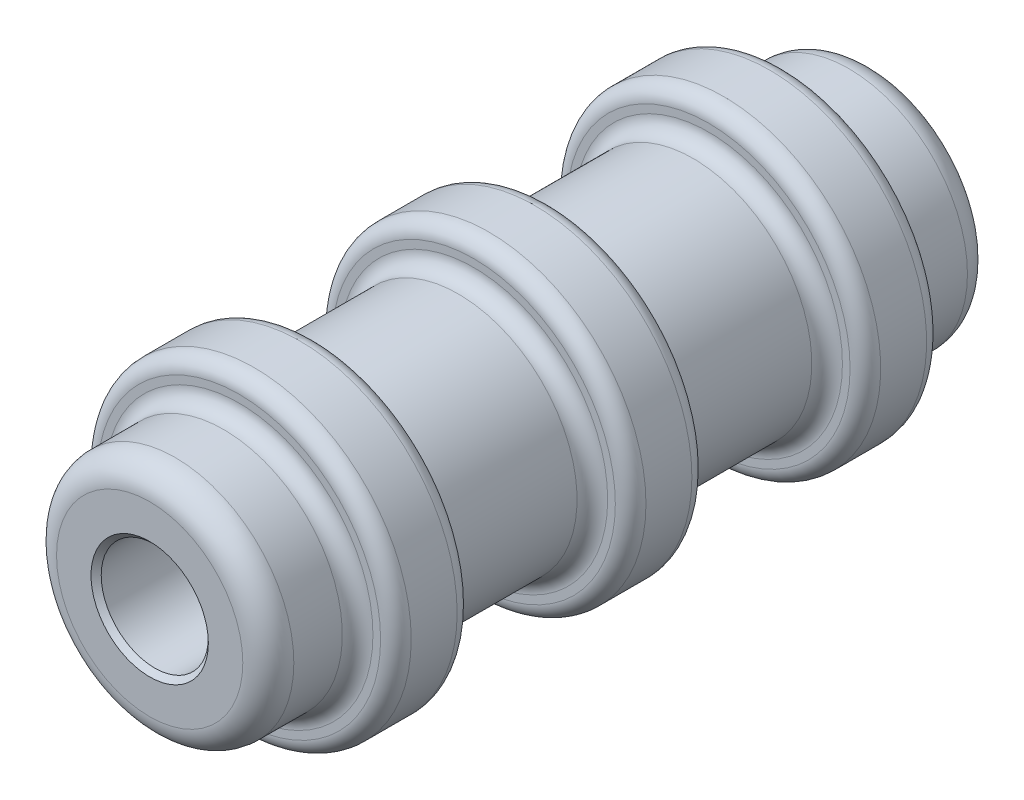
ISO-10303-21;
HEADER;
FILE_DESCRIPTION(('STEP AP214'),'2;1');
FILE_NAME('part.step','',(''),(''),'','','');
FILE_SCHEMA(('AUTOMOTIVE_DESIGN { 1 0 10303 214 1 1 1 1 }'));
ENDSEC;
DATA;
#1=APPLICATION_CONTEXT('core data for automotive mechanical design processes');
#2=APPLICATION_PROTOCOL_DEFINITION('international standard','automotive_design',2000,#1);
#3=PRODUCT_CONTEXT('',#1,'mechanical');
#4=PRODUCT('Part','Part','',(#3));
#5=PRODUCT_RELATED_PRODUCT_CATEGORY('part','',(#4));
#6=PRODUCT_DEFINITION_FORMATION('','',#4);
#7=PRODUCT_DEFINITION_CONTEXT('part definition',#1,'design');
#8=PRODUCT_DEFINITION('design','',#6,#7);
#9=PRODUCT_DEFINITION_SHAPE('','',#8);
#10=(LENGTH_UNIT() NAMED_UNIT(*) SI_UNIT(.MILLI.,.METRE.));
#11=(NAMED_UNIT(*) PLANE_ANGLE_UNIT() SI_UNIT($,.RADIAN.));
#12=(NAMED_UNIT(*) SI_UNIT($,.STERADIAN.) SOLID_ANGLE_UNIT());
#13=UNCERTAINTY_MEASURE_WITH_UNIT(LENGTH_MEASURE(1.E-05),#10,'distance_accuracy_value','');
#14=(GEOMETRIC_REPRESENTATION_CONTEXT(3) GLOBAL_UNCERTAINTY_ASSIGNED_CONTEXT((#13)) GLOBAL_UNIT_ASSIGNED_CONTEXT((#10,
#11,#12)) REPRESENTATION_CONTEXT('',''));
#15=CARTESIAN_POINT('',(0.,0.,0.));
#16=DIRECTION('',(0.,0.,1.));
#17=DIRECTION('',(1.,0.,0.));
#18=AXIS2_PLACEMENT_3D('',#15,#16,#17);
#19=CARTESIAN_POINT('',(0.,0.,0.750000000000001));
#20=DIRECTION('',(0.,0.,-1.));
#21=DIRECTION('',(-1.,0.,0.));
#22=AXIS2_PLACEMENT_3D('',#19,#20,#21);
#23=CYLINDRICAL_SURFACE('',#22,3.075);
#24=CARTESIAN_POINT('',(0.,0.,0.449999999999999));
#25=DIRECTION('',(0.,0.,1.));
#26=DIRECTION('',(1.,0.,0.));
#27=AXIS2_PLACEMENT_3D('',#24,#25,#26);
#28=CIRCLE('',#27,3.075);
#29=CARTESIAN_POINT('',(3.075,0.,0.449999999999999));
#30=VERTEX_POINT('',#29);
#31=EDGE_CURVE('E129',#30,#30,#28,.T.);
#32=ORIENTED_EDGE('',*,*,#31,.F.);
#33=EDGE_LOOP('',(#32));
#34=FACE_BOUND('',#33,.T.);
#35=CARTESIAN_POINT('',(0.,0.,-0.449999999999999));
#36=DIRECTION('',(0.,0.,1.));
#37=DIRECTION('',(1.,0.,0.));
#38=AXIS2_PLACEMENT_3D('',#35,#36,#37);
#39=CIRCLE('',#38,3.075);
#40=CARTESIAN_POINT('',(3.075,0.,-0.449999999999999));
#41=VERTEX_POINT('',#40);
#42=EDGE_CURVE('E183',#41,#41,#39,.F.);
#43=ORIENTED_EDGE('',*,*,#42,.F.);
#44=EDGE_LOOP('',(#43));
#45=FACE_BOUND('',#44,.T.);
#46=ADVANCED_FACE('F17',(#34,#45),#23,.T.);
#47=CARTESIAN_POINT('',(0.,0.,-0.449999999999999));
#48=DIRECTION('',(0.,0.,1.));
#49=DIRECTION('',(1.,0.,0.));
#50=AXIS2_PLACEMENT_3D('',#47,#48,#49);
#51=TOROIDAL_SURFACE('',#50,2.775,0.3);
#52=CARTESIAN_POINT('',(0.,0.,-0.749999999999999));
#53=DIRECTION('',(0.,0.,1.));
#54=DIRECTION('',(1.,0.,0.));
#55=AXIS2_PLACEMENT_3D('',#52,#53,#54);
#56=CIRCLE('',#55,2.775);
#57=CARTESIAN_POINT('',(2.775,0.,-0.75));
#58=VERTEX_POINT('',#57);
#59=CARTESIAN_POINT('',(-2.775,0.,-0.75));
#60=VERTEX_POINT('',#59);
#61=EDGE_CURVE('E116',#58,#60,#56,.T.);
#62=ORIENTED_EDGE('',*,*,#61,.T.);
#63=CARTESIAN_POINT('',(0.,0.,-0.749999999999999));
#64=DIRECTION('',(0.,0.,1.));
#65=DIRECTION('',(-1.,0.,0.));
#66=AXIS2_PLACEMENT_3D('',#63,#64,#65);
#67=CIRCLE('',#66,2.775);
#68=EDGE_CURVE('E119',#60,#58,#67,.T.);
#69=ORIENTED_EDGE('',*,*,#68,.T.);
#70=EDGE_LOOP('',(#62,#69));
#71=FACE_BOUND('',#70,.T.);
#72=ORIENTED_EDGE('',*,*,#42,.T.);
#73=EDGE_LOOP('',(#72));
#74=FACE_BOUND('',#73,.T.);
#75=ADVANCED_FACE('F127',(#71,#74),#51,.T.);
#76=CARTESIAN_POINT('',(0.,0.,0.449999999999999));
#77=DIRECTION('',(0.,0.,1.));
#78=DIRECTION('',(1.,0.,0.));
#79=AXIS2_PLACEMENT_3D('',#76,#77,#78);
#80=TOROIDAL_SURFACE('',#79,2.775,0.3);
#81=ORIENTED_EDGE('',*,*,#31,.T.);
#82=EDGE_LOOP('',(#81));
#83=FACE_BOUND('',#82,.T.);
#84=CARTESIAN_POINT('',(0.,0.,0.749999999999999));
#85=DIRECTION('',(0.,0.,-1.));
#86=DIRECTION('',(1.,0.,0.));
#87=AXIS2_PLACEMENT_3D('',#84,#85,#86);
#88=CIRCLE('',#87,2.775);
#89=CARTESIAN_POINT('',(-2.775,0.,0.75));
#90=VERTEX_POINT('',#89);
#91=CARTESIAN_POINT('',(2.775,0.,0.75));
#92=VERTEX_POINT('',#91);
#93=EDGE_CURVE('E163',#90,#92,#88,.F.);
#94=ORIENTED_EDGE('',*,*,#93,.F.);
#95=CARTESIAN_POINT('',(0.,0.,0.749999999999999));
#96=DIRECTION('',(0.,0.,-1.));
#97=DIRECTION('',(-1.,0.,0.));
#98=AXIS2_PLACEMENT_3D('',#95,#96,#97);
#99=CIRCLE('',#98,2.775);
#100=EDGE_CURVE('E124',#92,#90,#99,.F.);
#101=ORIENTED_EDGE('',*,*,#100,.F.);
#102=EDGE_LOOP('',(#94,#101));
#103=FACE_BOUND('',#102,.T.);
#104=ADVANCED_FACE('F137',(#83,#103),#80,.T.);
#105=CARTESIAN_POINT('',(0.,0.,-0.750000000000001));
#106=DIRECTION('',(0.,0.,1.));
#107=DIRECTION('',(1.,0.,0.));
#108=AXIS2_PLACEMENT_3D('',#105,#106,#107);
#109=PLANE('',#108);
#110=CARTESIAN_POINT('',(0.,0.,-0.749999999999999));
#111=DIRECTION('',(0.,0.,-1.));
#112=DIRECTION('',(1.,0.,0.));
#113=AXIS2_PLACEMENT_3D('',#110,#111,#112);
#114=CIRCLE('',#113,2.625);
#115=CARTESIAN_POINT('',(-2.625,0.,-0.75));
#116=VERTEX_POINT('',#115);
#117=CARTESIAN_POINT('',(2.625,0.,-0.75));
#118=VERTEX_POINT('',#117);
#119=EDGE_CURVE('E512',#116,#118,#114,.F.);
#120=ORIENTED_EDGE('',*,*,#119,.T.);
#121=CARTESIAN_POINT('',(0.,0.,-0.749999999999999));
#122=DIRECTION('',(0.,0.,-1.));
#123=DIRECTION('',(-1.,0.,0.));
#124=AXIS2_PLACEMENT_3D('',#121,#122,#123);
#125=CIRCLE('',#124,2.625);
#126=EDGE_CURVE('E522',#118,#116,#125,.F.);
#127=ORIENTED_EDGE('',*,*,#126,.T.);
#128=EDGE_LOOP('',(#120,#127));
#129=FACE_BOUND('',#128,.T.);
#130=ORIENTED_EDGE('',*,*,#61,.F.);
#131=ORIENTED_EDGE('',*,*,#68,.F.);
#132=EDGE_LOOP('',(#130,#131));
#133=FACE_BOUND('',#132,.T.);
#134=ADVANCED_FACE('F121',(#129,#133),#109,.F.);
#135=CARTESIAN_POINT('',(0.,0.,0.750000000000001));
#136=DIRECTION('',(0.,0.,1.));
#137=DIRECTION('',(1.,0.,0.));
#138=AXIS2_PLACEMENT_3D('',#135,#136,#137);
#139=PLANE('',#138);
#140=CARTESIAN_POINT('',(0.,0.,0.749999999999999));
#141=DIRECTION('',(0.,0.,1.));
#142=DIRECTION('',(-1.,0.,0.));
#143=AXIS2_PLACEMENT_3D('',#140,#141,#142);
#144=CIRCLE('',#143,2.625);
#145=CARTESIAN_POINT('',(2.625,0.,0.75));
#146=VERTEX_POINT('',#145);
#147=CARTESIAN_POINT('',(-2.625,0.,0.75));
#148=VERTEX_POINT('',#147);
#149=EDGE_CURVE('E526',#146,#148,#144,.F.);
#150=ORIENTED_EDGE('',*,*,#149,.T.);
#151=CARTESIAN_POINT('',(0.,0.,0.749999999999999));
#152=DIRECTION('',(0.,0.,1.));
#153=DIRECTION('',(1.,0.,0.));
#154=AXIS2_PLACEMENT_3D('',#151,#152,#153);
#155=CIRCLE('',#154,2.625);
#156=EDGE_CURVE('E551',#148,#146,#155,.F.);
#157=ORIENTED_EDGE('',*,*,#156,.T.);
#158=EDGE_LOOP('',(#150,#157));
#159=FACE_BOUND('',#158,.T.);
#160=ORIENTED_EDGE('',*,*,#100,.T.);
#161=ORIENTED_EDGE('',*,*,#93,.T.);
#162=EDGE_LOOP('',(#160,#161));
#163=FACE_BOUND('',#162,.T.);
#164=ADVANCED_FACE('F560',(#159,#163),#139,.T.);
#165=CARTESIAN_POINT('',(0.,0.,-1.05));
#166=DIRECTION('',(0.,0.,1.));
#167=DIRECTION('',(1.,0.,0.));
#168=AXIS2_PLACEMENT_3D('',#165,#166,#167);
#169=TOROIDAL_SURFACE('',#168,2.625,0.3);
#170=ORIENTED_EDGE('',*,*,#126,.F.);
#171=ORIENTED_EDGE('',*,*,#119,.F.);
#172=EDGE_LOOP('',(#170,#171));
#173=FACE_BOUND('',#172,.T.);
#174=CARTESIAN_POINT('',(0.,0.,-1.05));
#175=DIRECTION('',(0.,0.,-1.));
#176=DIRECTION('',(-1.,0.,0.));
#177=AXIS2_PLACEMENT_3D('',#174,#175,#176);
#178=CIRCLE('',#177,2.325);
#179=CARTESIAN_POINT('',(-2.325,0.,-1.05));
#180=VERTEX_POINT('',#179);
#181=EDGE_CURVE('E482',#180,#180,#178,.T.);
#182=ORIENTED_EDGE('',*,*,#181,.F.);
#183=EDGE_LOOP('',(#182));
#184=FACE_BOUND('',#183,.T.);
#185=ADVANCED_FACE('F492',(#173,#184),#169,.F.);
#186=CARTESIAN_POINT('',(0.,0.,1.05));
#187=DIRECTION('',(0.,0.,1.));
#188=DIRECTION('',(1.,0.,0.));
#189=AXIS2_PLACEMENT_3D('',#186,#187,#188);
#190=TOROIDAL_SURFACE('',#189,2.625,0.3);
#191=CARTESIAN_POINT('',(0.,0.,1.05));
#192=DIRECTION('',(0.,0.,-1.));
#193=DIRECTION('',(-1.,0.,0.));
#194=AXIS2_PLACEMENT_3D('',#191,#192,#193);
#195=CIRCLE('',#194,2.325);
#196=CARTESIAN_POINT('',(-2.325,0.,1.05));
#197=VERTEX_POINT('',#196);
#198=EDGE_CURVE('E479',#197,#197,#195,.F.);
#199=ORIENTED_EDGE('',*,*,#198,.F.);
#200=EDGE_LOOP('',(#199));
#201=FACE_BOUND('',#200,.T.);
#202=ORIENTED_EDGE('',*,*,#149,.F.);
#203=ORIENTED_EDGE('',*,*,#156,.F.);
#204=EDGE_LOOP('',(#202,#203));
#205=FACE_BOUND('',#204,.T.);
#206=ADVANCED_FACE('F487',(#201,#205),#190,.F.);
#207=CARTESIAN_POINT('',(0.,0.,7.1));
#208=DIRECTION('',(0.,0.,-1.));
#209=DIRECTION('',(-1.,0.,0.));
#210=AXIS2_PLACEMENT_3D('',#207,#208,#209);
#211=CYLINDRICAL_SURFACE('',#210,2.325);
#212=CARTESIAN_POINT('',(0.,0.,-3.55));
#213=DIRECTION('',(0.,0.,-1.));
#214=DIRECTION('',(-1.,0.,0.));
#215=AXIS2_PLACEMENT_3D('',#212,#213,#214);
#216=CIRCLE('',#215,2.325);
#217=CARTESIAN_POINT('',(-2.325,0.,-3.55));
#218=VERTEX_POINT('',#217);
#219=EDGE_CURVE('E476',#218,#218,#216,.F.);
#220=ORIENTED_EDGE('',*,*,#219,.T.);
#221=EDGE_LOOP('',(#220));
#222=FACE_BOUND('',#221,.T.);
#223=ORIENTED_EDGE('',*,*,#181,.T.);
#224=EDGE_LOOP('',(#223));
#225=FACE_BOUND('',#224,.T.);
#226=ADVANCED_FACE('F491',(#222,#225),#211,.T.);
#227=CARTESIAN_POINT('',(0.,0.,7.1));
#228=DIRECTION('',(0.,0.,-1.));
#229=DIRECTION('',(-1.,0.,0.));
#230=AXIS2_PLACEMENT_3D('',#227,#228,#229);
#231=CYLINDRICAL_SURFACE('',#230,2.325);
#232=ORIENTED_EDGE('',*,*,#198,.T.);
#233=EDGE_LOOP('',(#232));
#234=FACE_BOUND('',#233,.T.);
#235=CARTESIAN_POINT('',(0.,0.,3.55));
#236=DIRECTION('',(0.,0.,1.));
#237=DIRECTION('',(1.,0.,0.));
#238=AXIS2_PLACEMENT_3D('',#235,#236,#237);
#239=CIRCLE('',#238,2.325);
#240=CARTESIAN_POINT('',(2.325,0.,3.55));
#241=VERTEX_POINT('',#240);
#242=EDGE_CURVE('E467',#241,#241,#239,.F.);
#243=ORIENTED_EDGE('',*,*,#242,.T.);
#244=EDGE_LOOP('',(#243));
#245=FACE_BOUND('',#244,.T.);
#246=ADVANCED_FACE('F766',(#234,#245),#231,.T.);
#247=CARTESIAN_POINT('',(0.,0.,-3.55));
#248=DIRECTION('',(0.,0.,-1.));
#249=DIRECTION('',(-1.,0.,0.));
#250=AXIS2_PLACEMENT_3D('',#247,#248,#249);
#251=TOROIDAL_SURFACE('',#250,2.625,0.3);
#252=CARTESIAN_POINT('',(0.,0.,-3.85));
#253=DIRECTION('',(0.,0.,1.));
#254=DIRECTION('',(1.,0.,0.));
#255=AXIS2_PLACEMENT_3D('',#252,#253,#254);
#256=CIRCLE('',#255,2.625);
#257=CARTESIAN_POINT('',(2.625,0.,-3.85));
#258=VERTEX_POINT('',#257);
#259=CARTESIAN_POINT('',(-2.625,0.,-3.85));
#260=VERTEX_POINT('',#259);
#261=EDGE_CURVE('E463',#258,#260,#256,.T.);
#262=ORIENTED_EDGE('',*,*,#261,.T.);
#263=CARTESIAN_POINT('',(0.,0.,-3.85));
#264=DIRECTION('',(0.,0.,1.));
#265=DIRECTION('',(-1.,0.,0.));
#266=AXIS2_PLACEMENT_3D('',#263,#264,#265);
#267=CIRCLE('',#266,2.625);
#268=EDGE_CURVE('E475',#260,#258,#267,.T.);
#269=ORIENTED_EDGE('',*,*,#268,.T.);
#270=EDGE_LOOP('',(#262,#269));
#271=FACE_BOUND('',#270,.T.);
#272=ORIENTED_EDGE('',*,*,#219,.F.);
#273=EDGE_LOOP('',(#272));
#274=FACE_BOUND('',#273,.T.);
#275=ADVANCED_FACE('F437',(#271,#274),#251,.F.);
#276=CARTESIAN_POINT('',(0.,0.,3.55));
#277=DIRECTION('',(0.,0.,1.));
#278=DIRECTION('',(1.,0.,0.));
#279=AXIS2_PLACEMENT_3D('',#276,#277,#278);
#280=TOROIDAL_SURFACE('',#279,2.625,0.3);
#281=CARTESIAN_POINT('',(0.,0.,3.85));
#282=DIRECTION('',(0.,0.,-1.));
#283=DIRECTION('',(-1.,0.,0.));
#284=AXIS2_PLACEMENT_3D('',#281,#282,#283);
#285=CIRCLE('',#284,2.625);
#286=CARTESIAN_POINT('',(-2.625,0.,3.85));
#287=VERTEX_POINT('',#286);
#288=CARTESIAN_POINT('',(2.625,0.,3.85));
#289=VERTEX_POINT('',#288);
#290=EDGE_CURVE('E450',#287,#289,#285,.T.);
#291=ORIENTED_EDGE('',*,*,#290,.T.);
#292=CARTESIAN_POINT('',(0.,0.,3.85));
#293=DIRECTION('',(0.,0.,-1.));
#294=DIRECTION('',(1.,0.,0.));
#295=AXIS2_PLACEMENT_3D('',#292,#293,#294);
#296=CIRCLE('',#295,2.625);
#297=EDGE_CURVE('E418',#289,#287,#296,.T.);
#298=ORIENTED_EDGE('',*,*,#297,.T.);
#299=EDGE_LOOP('',(#291,#298));
#300=FACE_BOUND('',#299,.T.);
#301=ORIENTED_EDGE('',*,*,#242,.F.);
#302=EDGE_LOOP('',(#301));
#303=FACE_BOUND('',#302,.T.);
#304=ADVANCED_FACE('F425',(#300,#303),#280,.F.);
#305=CARTESIAN_POINT('',(0.,0.,-3.85));
#306=DIRECTION('',(0.,0.,-1.));
#307=DIRECTION('',(-1.,0.,0.));
#308=AXIS2_PLACEMENT_3D('',#305,#306,#307);
#309=PLANE('',#308);
#310=ORIENTED_EDGE('',*,*,#268,.F.);
#311=ORIENTED_EDGE('',*,*,#261,.F.);
#312=EDGE_LOOP('',(#310,#311));
#313=FACE_BOUND('',#312,.T.);
#314=CARTESIAN_POINT('',(0.,0.,-3.85));
#315=DIRECTION('',(0.,0.,-1.));
#316=DIRECTION('',(-1.,0.,0.));
#317=AXIS2_PLACEMENT_3D('',#314,#315,#316);
#318=CIRCLE('',#317,2.775);
#319=CARTESIAN_POINT('',(-2.775,0.,-3.85));
#320=VERTEX_POINT('',#319);
#321=CARTESIAN_POINT('',(2.775,0.,-3.85));
#322=VERTEX_POINT('',#321);
#323=EDGE_CURVE('E404',#320,#322,#318,.T.);
#324=ORIENTED_EDGE('',*,*,#323,.F.);
#325=CARTESIAN_POINT('',(0.,0.,-3.85));
#326=DIRECTION('',(0.,0.,-1.));
#327=DIRECTION('',(1.,0.,0.));
#328=AXIS2_PLACEMENT_3D('',#325,#326,#327);
#329=CIRCLE('',#328,2.775);
#330=EDGE_CURVE('E896',#322,#320,#329,.T.);
#331=ORIENTED_EDGE('',*,*,#330,.F.);
#332=EDGE_LOOP('',(#324,#331));
#333=FACE_BOUND('',#332,.T.);
#334=ADVANCED_FACE('F436',(#313,#333),#309,.F.);
#335=CARTESIAN_POINT('',(0.,0.,3.85));
#336=DIRECTION('',(0.,0.,1.));
#337=DIRECTION('',(1.,0.,0.));
#338=AXIS2_PLACEMENT_3D('',#335,#336,#337);
#339=PLANE('',#338);
#340=ORIENTED_EDGE('',*,*,#297,.F.);
#341=ORIENTED_EDGE('',*,*,#290,.F.);
#342=EDGE_LOOP('',(#340,#341));
#343=FACE_BOUND('',#342,.T.);
#344=CARTESIAN_POINT('',(0.,0.,3.85));
#345=DIRECTION('',(0.,0.,1.));
#346=DIRECTION('',(1.,0.,0.));
#347=AXIS2_PLACEMENT_3D('',#344,#345,#346);
#348=CIRCLE('',#347,2.775);
#349=CARTESIAN_POINT('',(2.775,0.,3.85));
#350=VERTEX_POINT('',#349);
#351=CARTESIAN_POINT('',(-2.775,0.,3.85));
#352=VERTEX_POINT('',#351);
#353=EDGE_CURVE('E932',#350,#352,#348,.T.);
#354=ORIENTED_EDGE('',*,*,#353,.F.);
#355=CARTESIAN_POINT('',(0.,0.,3.85));
#356=DIRECTION('',(0.,0.,1.));
#357=DIRECTION('',(-1.,0.,0.));
#358=AXIS2_PLACEMENT_3D('',#355,#356,#357);
#359=CIRCLE('',#358,2.775);
#360=EDGE_CURVE('E933',#352,#350,#359,.T.);
#361=ORIENTED_EDGE('',*,*,#360,.F.);
#362=EDGE_LOOP('',(#354,#361));
#363=FACE_BOUND('',#362,.T.);
#364=ADVANCED_FACE('F740',(#343,#363),#339,.F.);
#365=CARTESIAN_POINT('',(0.,0.,-4.15));
#366=DIRECTION('',(0.,0.,-1.));
#367=DIRECTION('',(-1.,0.,0.));
#368=AXIS2_PLACEMENT_3D('',#365,#366,#367);
#369=TOROIDAL_SURFACE('',#368,2.775,0.3);
#370=ORIENTED_EDGE('',*,*,#323,.T.);
#371=ORIENTED_EDGE('',*,*,#330,.T.);
#372=EDGE_LOOP('',(#370,#371));
#373=FACE_BOUND('',#372,.T.);
#374=CARTESIAN_POINT('',(0.,0.,-4.15));
#375=DIRECTION('',(0.,0.,-1.));
#376=DIRECTION('',(-1.,0.,0.));
#377=AXIS2_PLACEMENT_3D('',#374,#375,#376);
#378=CIRCLE('',#377,3.075);
#379=CARTESIAN_POINT('',(-3.075,0.,-4.15));
#380=VERTEX_POINT('',#379);
#381=EDGE_CURVE('E370',#380,#380,#378,.T.);
#382=ORIENTED_EDGE('',*,*,#381,.F.);
#383=EDGE_LOOP('',(#382));
#384=FACE_BOUND('',#383,.T.);
#385=ADVANCED_FACE('F381',(#373,#384),#369,.T.);
#386=CARTESIAN_POINT('',(0.,0.,4.15));
#387=DIRECTION('',(0.,0.,1.));
#388=DIRECTION('',(1.,0.,0.));
#389=AXIS2_PLACEMENT_3D('',#386,#387,#388);
#390=TOROIDAL_SURFACE('',#389,2.775,0.3);
#391=ORIENTED_EDGE('',*,*,#353,.T.);
#392=ORIENTED_EDGE('',*,*,#360,.T.);
#393=EDGE_LOOP('',(#391,#392));
#394=FACE_BOUND('',#393,.T.);
#395=CARTESIAN_POINT('',(0.,0.,4.15));
#396=DIRECTION('',(0.,0.,1.));
#397=DIRECTION('',(1.,0.,0.));
#398=AXIS2_PLACEMENT_3D('',#395,#396,#397);
#399=CIRCLE('',#398,3.075);
#400=CARTESIAN_POINT('',(3.075,0.,4.15));
#401=VERTEX_POINT('',#400);
#402=EDGE_CURVE('E367',#401,#401,#399,.T.);
#403=ORIENTED_EDGE('',*,*,#402,.F.);
#404=EDGE_LOOP('',(#403));
#405=FACE_BOUND('',#404,.T.);
#406=ADVANCED_FACE('F375',(#394,#405),#390,.T.);
#407=CARTESIAN_POINT('',(0.,0.,-3.85));
#408=DIRECTION('',(0.,0.,-1.));
#409=DIRECTION('',(-1.,0.,0.));
#410=AXIS2_PLACEMENT_3D('',#407,#408,#409);
#411=CYLINDRICAL_SURFACE('',#410,3.075);
#412=ORIENTED_EDGE('',*,*,#381,.T.);
#413=EDGE_LOOP('',(#412));
#414=FACE_BOUND('',#413,.T.);
#415=CARTESIAN_POINT('',(0.,0.,-5.05));
#416=DIRECTION('',(0.,0.,-1.));
#417=DIRECTION('',(-1.,0.,0.));
#418=AXIS2_PLACEMENT_3D('',#415,#416,#417);
#419=CIRCLE('',#418,3.075);
#420=CARTESIAN_POINT('',(-3.075,0.,-5.05));
#421=VERTEX_POINT('',#420);
#422=EDGE_CURVE('E364',#421,#421,#419,.T.);
#423=ORIENTED_EDGE('',*,*,#422,.F.);
#424=EDGE_LOOP('',(#423));
#425=FACE_BOUND('',#424,.T.);
#426=ADVANCED_FACE('F380',(#414,#425),#411,.T.);
#427=CARTESIAN_POINT('',(0.,0.,3.85));
#428=DIRECTION('',(0.,0.,1.));
#429=DIRECTION('',(1.,0.,0.));
#430=AXIS2_PLACEMENT_3D('',#427,#428,#429);
#431=CYLINDRICAL_SURFACE('',#430,3.075);
#432=ORIENTED_EDGE('',*,*,#402,.T.);
#433=EDGE_LOOP('',(#432));
#434=FACE_BOUND('',#433,.T.);
#435=CARTESIAN_POINT('',(0.,0.,5.05));
#436=DIRECTION('',(0.,0.,1.));
#437=DIRECTION('',(1.,0.,0.));
#438=AXIS2_PLACEMENT_3D('',#435,#436,#437);
#439=CIRCLE('',#438,3.075);
#440=CARTESIAN_POINT('',(3.075,0.,5.05));
#441=VERTEX_POINT('',#440);
#442=EDGE_CURVE('E355',#441,#441,#439,.T.);
#443=ORIENTED_EDGE('',*,*,#442,.F.);
#444=EDGE_LOOP('',(#443));
#445=FACE_BOUND('',#444,.T.);
#446=ADVANCED_FACE('F713',(#434,#445),#431,.T.);
#447=CARTESIAN_POINT('',(0.,0.,-5.05));
#448=DIRECTION('',(0.,0.,-1.));
#449=DIRECTION('',(-1.,0.,0.));
#450=AXIS2_PLACEMENT_3D('',#447,#448,#449);
#451=TOROIDAL_SURFACE('',#450,2.775,0.3);
#452=ORIENTED_EDGE('',*,*,#422,.T.);
#453=EDGE_LOOP('',(#452));
#454=FACE_BOUND('',#453,.T.);
#455=CARTESIAN_POINT('',(0.,0.,-5.35));
#456=DIRECTION('',(0.,0.,1.));
#457=DIRECTION('',(-1.,0.,0.));
#458=AXIS2_PLACEMENT_3D('',#455,#456,#457);
#459=CIRCLE('',#458,2.775);
#460=CARTESIAN_POINT('',(2.775,0.,-5.35));
#461=VERTEX_POINT('',#460);
#462=CARTESIAN_POINT('',(-2.775,0.,-5.35));
#463=VERTEX_POINT('',#462);
#464=EDGE_CURVE('E351',#461,#463,#459,.F.);
#465=ORIENTED_EDGE('',*,*,#464,.F.);
#466=CARTESIAN_POINT('',(0.,0.,-5.35));
#467=DIRECTION('',(0.,0.,1.));
#468=DIRECTION('',(1.,0.,0.));
#469=AXIS2_PLACEMENT_3D('',#466,#467,#468);
#470=CIRCLE('',#469,2.775);
#471=EDGE_CURVE('E363',#463,#461,#470,.F.);
#472=ORIENTED_EDGE('',*,*,#471,.F.);
#473=EDGE_LOOP('',(#465,#472));
#474=FACE_BOUND('',#473,.T.);
#475=ADVANCED_FACE('F324',(#454,#474),#451,.T.);
#476=CARTESIAN_POINT('',(0.,0.,5.05));
#477=DIRECTION('',(0.,0.,1.));
#478=DIRECTION('',(1.,0.,0.));
#479=AXIS2_PLACEMENT_3D('',#476,#477,#478);
#480=TOROIDAL_SURFACE('',#479,2.775,0.3);
#481=ORIENTED_EDGE('',*,*,#442,.T.);
#482=EDGE_LOOP('',(#481));
#483=FACE_BOUND('',#482,.T.);
#484=CARTESIAN_POINT('',(0.,0.,5.35));
#485=DIRECTION('',(0.,0.,-1.));
#486=DIRECTION('',(1.,0.,0.));
#487=AXIS2_PLACEMENT_3D('',#484,#485,#486);
#488=CIRCLE('',#487,2.775);
#489=CARTESIAN_POINT('',(-2.775,0.,5.35));
#490=VERTEX_POINT('',#489);
#491=CARTESIAN_POINT('',(2.775,0.,5.35));
#492=VERTEX_POINT('',#491);
#493=EDGE_CURVE('E338',#490,#492,#488,.F.);
#494=ORIENTED_EDGE('',*,*,#493,.F.);
#495=CARTESIAN_POINT('',(0.,0.,5.35));
#496=DIRECTION('',(0.,0.,-1.));
#497=DIRECTION('',(-1.,0.,0.));
#498=AXIS2_PLACEMENT_3D('',#495,#496,#497);
#499=CIRCLE('',#498,2.775);
#500=EDGE_CURVE('E305',#492,#490,#499,.F.);
#501=ORIENTED_EDGE('',*,*,#500,.F.);
#502=EDGE_LOOP('',(#494,#501));
#503=FACE_BOUND('',#502,.T.);
#504=ADVANCED_FACE('F312',(#483,#503),#480,.T.);
#505=CARTESIAN_POINT('',(0.,0.,-5.35));
#506=DIRECTION('',(0.,0.,-1.));
#507=DIRECTION('',(-1.,0.,0.));
#508=AXIS2_PLACEMENT_3D('',#505,#506,#507);
#509=PLANE('',#508);
#510=CARTESIAN_POINT('',(0.,0.,-5.35));
#511=DIRECTION('',(0.,0.,-1.));
#512=DIRECTION('',(1.,0.,0.));
#513=AXIS2_PLACEMENT_3D('',#510,#511,#512);
#514=CIRCLE('',#513,2.625);
#515=CARTESIAN_POINT('',(-2.625,0.,-5.35));
#516=VERTEX_POINT('',#515);
#517=CARTESIAN_POINT('',(2.625,0.,-5.35));
#518=VERTEX_POINT('',#517);
#519=EDGE_CURVE('E987',#516,#518,#514,.F.);
#520=ORIENTED_EDGE('',*,*,#519,.T.);
#521=CARTESIAN_POINT('',(0.,0.,-5.35));
#522=DIRECTION('',(0.,0.,-1.));
#523=DIRECTION('',(-1.,0.,0.));
#524=AXIS2_PLACEMENT_3D('',#521,#522,#523);
#525=CIRCLE('',#524,2.625);
#526=EDGE_CURVE('E291',#518,#516,#525,.F.);
#527=ORIENTED_EDGE('',*,*,#526,.T.);
#528=EDGE_LOOP('',(#520,#527));
#529=FACE_BOUND('',#528,.T.);
#530=ORIENTED_EDGE('',*,*,#471,.T.);
#531=ORIENTED_EDGE('',*,*,#464,.T.);
#532=EDGE_LOOP('',(#530,#531));
#533=FACE_BOUND('',#532,.T.);
#534=ADVANCED_FACE('F323',(#529,#533),#509,.T.);
#535=CARTESIAN_POINT('',(0.,0.,5.35));
#536=DIRECTION('',(0.,0.,1.));
#537=DIRECTION('',(1.,0.,0.));
#538=AXIS2_PLACEMENT_3D('',#535,#536,#537);
#539=PLANE('',#538);
#540=CARTESIAN_POINT('',(0.,0.,5.35));
#541=DIRECTION('',(0.,0.,1.));
#542=DIRECTION('',(-1.,0.,0.));
#543=AXIS2_PLACEMENT_3D('',#540,#541,#542);
#544=CIRCLE('',#543,2.625);
#545=CARTESIAN_POINT('',(2.625,0.,5.35));
#546=VERTEX_POINT('',#545);
#547=CARTESIAN_POINT('',(-2.625,0.,5.35));
#548=VERTEX_POINT('',#547);
#549=EDGE_CURVE('E1025',#546,#548,#544,.F.);
#550=ORIENTED_EDGE('',*,*,#549,.T.);
#551=CARTESIAN_POINT('',(0.,0.,5.35));
#552=DIRECTION('',(0.,0.,1.));
#553=DIRECTION('',(1.,0.,0.));
#554=AXIS2_PLACEMENT_3D('',#551,#552,#553);
#555=CIRCLE('',#554,2.625);
#556=EDGE_CURVE('E1024',#548,#546,#555,.F.);
#557=ORIENTED_EDGE('',*,*,#556,.T.);
#558=EDGE_LOOP('',(#550,#557));
#559=FACE_BOUND('',#558,.T.);
#560=ORIENTED_EDGE('',*,*,#500,.T.);
#561=ORIENTED_EDGE('',*,*,#493,.T.);
#562=EDGE_LOOP('',(#560,#561));
#563=FACE_BOUND('',#562,.T.);
#564=ADVANCED_FACE('F687',(#559,#563),#539,.T.);
#565=CARTESIAN_POINT('',(0.,0.,-5.65));
#566=DIRECTION('',(0.,0.,-1.));
#567=DIRECTION('',(-1.,0.,0.));
#568=AXIS2_PLACEMENT_3D('',#565,#566,#567);
#569=TOROIDAL_SURFACE('',#568,2.625,0.3);
#570=ORIENTED_EDGE('',*,*,#519,.F.);
#571=ORIENTED_EDGE('',*,*,#526,.F.);
#572=EDGE_LOOP('',(#570,#571));
#573=FACE_BOUND('',#572,.T.);
#574=CARTESIAN_POINT('',(0.,0.,-5.65));
#575=DIRECTION('',(0.,0.,-1.));
#576=DIRECTION('',(-1.,0.,0.));
#577=AXIS2_PLACEMENT_3D('',#574,#575,#576);
#578=CIRCLE('',#577,2.325);
#579=CARTESIAN_POINT('',(-2.325,0.,-5.65));
#580=VERTEX_POINT('',#579);
#581=EDGE_CURVE('E1066',#580,#580,#578,.T.);
#582=ORIENTED_EDGE('',*,*,#581,.F.);
#583=EDGE_LOOP('',(#582));
#584=FACE_BOUND('',#583,.T.);
#585=ADVANCED_FACE('F267',(#573,#584),#569,.F.);
#586=CARTESIAN_POINT('',(0.,0.,5.65));
#587=DIRECTION('',(0.,0.,1.));
#588=DIRECTION('',(1.,0.,0.));
#589=AXIS2_PLACEMENT_3D('',#586,#587,#588);
#590=TOROIDAL_SURFACE('',#589,2.625,0.3);
#591=ORIENTED_EDGE('',*,*,#549,.F.);
#592=ORIENTED_EDGE('',*,*,#556,.F.);
#593=EDGE_LOOP('',(#591,#592));
#594=FACE_BOUND('',#593,.T.);
#595=CARTESIAN_POINT('',(0.,0.,5.65));
#596=DIRECTION('',(0.,0.,-1.));
#597=DIRECTION('',(-1.,0.,0.));
#598=AXIS2_PLACEMENT_3D('',#595,#596,#597);
#599=CIRCLE('',#598,2.325);
#600=CARTESIAN_POINT('',(-2.325,0.,5.65));
#601=VERTEX_POINT('',#600);
#602=EDGE_CURVE('E256',#601,#601,#599,.F.);
#603=ORIENTED_EDGE('',*,*,#602,.F.);
#604=EDGE_LOOP('',(#603));
#605=FACE_BOUND('',#604,.T.);
#606=ADVANCED_FACE('F261',(#594,#605),#590,.F.);
#607=CARTESIAN_POINT('',(0.,0.,7.1));
#608=DIRECTION('',(0.,0.,-1.));
#609=DIRECTION('',(-1.,0.,0.));
#610=AXIS2_PLACEMENT_3D('',#607,#608,#609);
#611=CYLINDRICAL_SURFACE('',#610,2.325);
#612=ORIENTED_EDGE('',*,*,#581,.T.);
#613=EDGE_LOOP('',(#612));
#614=FACE_BOUND('',#613,.T.);
#615=CARTESIAN_POINT('',(0.,0.,-6.6));
#616=DIRECTION('',(0.,0.,1.));
#617=DIRECTION('',(1.,0.,0.));
#618=AXIS2_PLACEMENT_3D('',#615,#616,#617);
#619=CIRCLE('',#618,2.325);
#620=CARTESIAN_POINT('',(2.325,0.,-6.6));
#621=VERTEX_POINT('',#620);
#622=EDGE_CURVE('E253',#621,#621,#619,.F.);
#623=ORIENTED_EDGE('',*,*,#622,.F.);
#624=EDGE_LOOP('',(#623));
#625=FACE_BOUND('',#624,.T.);
#626=ADVANCED_FACE('F266',(#614,#625),#611,.T.);
#627=CARTESIAN_POINT('',(0.,0.,7.1));
#628=DIRECTION('',(0.,0.,-1.));
#629=DIRECTION('',(-1.,0.,0.));
#630=AXIS2_PLACEMENT_3D('',#627,#628,#629);
#631=CYLINDRICAL_SURFACE('',#630,2.325);
#632=CARTESIAN_POINT('',(0.,0.,6.6));
#633=DIRECTION('',(0.,0.,1.));
#634=DIRECTION('',(1.,0.,0.));
#635=AXIS2_PLACEMENT_3D('',#632,#633,#634);
#636=CIRCLE('',#635,2.325);
#637=CARTESIAN_POINT('',(2.325,0.,6.6));
#638=VERTEX_POINT('',#637);
#639=EDGE_CURVE('E244',#638,#638,#636,.T.);
#640=ORIENTED_EDGE('',*,*,#639,.F.);
#641=EDGE_LOOP('',(#640));
#642=FACE_BOUND('',#641,.T.);
#643=ORIENTED_EDGE('',*,*,#602,.T.);
#644=EDGE_LOOP('',(#643));
#645=FACE_BOUND('',#644,.T.);
#646=ADVANCED_FACE('F661',(#642,#645),#631,.T.);
#647=CARTESIAN_POINT('',(0.,0.,-6.6));
#648=DIRECTION('',(0.,0.,1.));
#649=DIRECTION('',(1.,0.,0.));
#650=AXIS2_PLACEMENT_3D('',#647,#648,#649);
#651=TOROIDAL_SURFACE('',#650,1.825,0.5);
#652=CARTESIAN_POINT('',(0.,0.,-7.1));
#653=DIRECTION('',(0.,0.,1.));
#654=DIRECTION('',(1.,0.,0.));
#655=AXIS2_PLACEMENT_3D('',#652,#653,#654);
#656=CIRCLE('',#655,1.825);
#657=CARTESIAN_POINT('',(1.825,0.,-7.1));
#658=VERTEX_POINT('',#657);
#659=CARTESIAN_POINT('',(-1.825,0.,-7.1));
#660=VERTEX_POINT('',#659);
#661=EDGE_CURVE('E252',#658,#660,#656,.T.);
#662=ORIENTED_EDGE('',*,*,#661,.T.);
#663=CARTESIAN_POINT('',(0.,0.,-7.1));
#664=DIRECTION('',(0.,0.,1.));
#665=DIRECTION('',(-1.,0.,0.));
#666=AXIS2_PLACEMENT_3D('',#663,#664,#665);
#667=CIRCLE('',#666,1.825);
#668=EDGE_CURVE('E240',#660,#658,#667,.T.);
#669=ORIENTED_EDGE('',*,*,#668,.T.);
#670=EDGE_LOOP('',(#662,#669));
#671=FACE_BOUND('',#670,.T.);
#672=ORIENTED_EDGE('',*,*,#622,.T.);
#673=EDGE_LOOP('',(#672));
#674=FACE_BOUND('',#673,.T.);
#675=ADVANCED_FACE('F213',(#671,#674),#651,.T.);
#676=CARTESIAN_POINT('',(0.,0.,6.6));
#677=DIRECTION('',(0.,0.,1.));
#678=DIRECTION('',(1.,0.,0.));
#679=AXIS2_PLACEMENT_3D('',#676,#677,#678);
#680=TOROIDAL_SURFACE('',#679,1.825,0.5);
#681=ORIENTED_EDGE('',*,*,#639,.T.);
#682=EDGE_LOOP('',(#681));
#683=FACE_BOUND('',#682,.T.);
#684=CARTESIAN_POINT('',(0.,0.,7.1));
#685=DIRECTION('',(0.,0.,-1.));
#686=DIRECTION('',(1.,0.,0.));
#687=AXIS2_PLACEMENT_3D('',#684,#685,#686);
#688=CIRCLE('',#687,1.825);
#689=CARTESIAN_POINT('',(-1.825,0.,7.1));
#690=VERTEX_POINT('',#689);
#691=CARTESIAN_POINT('',(1.825,0.,7.1));
#692=VERTEX_POINT('',#691);
#693=EDGE_CURVE('E192',#690,#692,#688,.F.);
#694=ORIENTED_EDGE('',*,*,#693,.F.);
#695=CARTESIAN_POINT('',(0.,0.,7.1));
#696=DIRECTION('',(0.,0.,-1.));
#697=DIRECTION('',(-1.,0.,0.));
#698=AXIS2_PLACEMENT_3D('',#695,#696,#697);
#699=CIRCLE('',#698,1.825);
#700=EDGE_CURVE('E35',#692,#690,#699,.F.);
#701=ORIENTED_EDGE('',*,*,#700,.F.);
#702=EDGE_LOOP('',(#694,#701));
#703=FACE_BOUND('',#702,.T.);
#704=ADVANCED_FACE('F201',(#683,#703),#680,.T.);
#705=CARTESIAN_POINT('',(0.,0.,-7.1));
#706=DIRECTION('',(0.,0.,1.));
#707=DIRECTION('',(1.,0.,0.));
#708=AXIS2_PLACEMENT_3D('',#705,#706,#707);
#709=PLANE('',#708);
#710=ORIENTED_EDGE('',*,*,#661,.F.);
#711=ORIENTED_EDGE('',*,*,#668,.F.);
#712=EDGE_LOOP('',(#710,#711));
#713=FACE_BOUND('',#712,.T.);
#714=CARTESIAN_POINT('',(0.,0.,-7.10000000003674));
#715=DIRECTION('',(0.,0.,-1.));
#716=DIRECTION('',(-1.,0.,0.));
#717=AXIS2_PLACEMENT_3D('',#714,#715,#716);
#718=CIRCLE('',#717,1.15000000005239);
#719=CARTESIAN_POINT('',(-1.15000000005239,0.,-7.10000000003674));
#720=VERTEX_POINT('',#719);
#721=EDGE_CURVE('E189',#720,#720,#718,.F.);
#722=ORIENTED_EDGE('',*,*,#721,.T.);
#723=EDGE_LOOP('',(#722));
#724=FACE_BOUND('',#723,.T.);
#725=ADVANCED_FACE('F212',(#713,#724),#709,.F.);
#726=CARTESIAN_POINT('',(0.,0.,7.1));
#727=DIRECTION('',(0.,0.,1.));
#728=DIRECTION('',(1.,0.,0.));
#729=AXIS2_PLACEMENT_3D('',#726,#727,#728);
#730=PLANE('',#729);
#731=ORIENTED_EDGE('',*,*,#700,.T.);
#732=ORIENTED_EDGE('',*,*,#693,.T.);
#733=EDGE_LOOP('',(#731,#732));
#734=FACE_BOUND('',#733,.T.);
#735=CARTESIAN_POINT('',(0.,0.,7.0999999999799));
#736=DIRECTION('',(0.,0.,1.));
#737=DIRECTION('',(1.,0.,0.));
#738=AXIS2_PLACEMENT_3D('',#735,#736,#737);
#739=CIRCLE('',#738,1.15000000005239);
#740=CARTESIAN_POINT('',(1.15000000005239,0.,7.0999999999799));
#741=VERTEX_POINT('',#740);
#742=EDGE_CURVE('E186',#741,#741,#739,.F.);
#743=ORIENTED_EDGE('',*,*,#742,.T.);
#744=EDGE_LOOP('',(#743));
#745=FACE_BOUND('',#744,.T.);
#746=ADVANCED_FACE('F580',(#734,#745),#730,.T.);
#747=CARTESIAN_POINT('',(0.,0.,-7.09999999992306));
#748=DIRECTION('',(0.,0.,-1.));
#749=DIRECTION('',(-1.,0.,0.));
#750=AXIS2_PLACEMENT_3D('',#747,#748,#749);
#751=CONICAL_SURFACE('',#750,1.1499999999387,0.785398163397448);
#752=CARTESIAN_POINT('',(0.,0.,-7.));
#753=DIRECTION('',(0.,0.,-1.));
#754=DIRECTION('',(-1.,0.,0.));
#755=AXIS2_PLACEMENT_3D('',#752,#753,#754);
#756=CIRCLE('',#755,1.05);
#757=CARTESIAN_POINT('',(-1.05,0.,-7.));
#758=VERTEX_POINT('',#757);
#759=EDGE_CURVE('E27',#758,#758,#756,.F.);
#760=ORIENTED_EDGE('',*,*,#759,.T.);
#761=EDGE_LOOP('',(#760));
#762=FACE_BOUND('',#761,.T.);
#763=ORIENTED_EDGE('',*,*,#721,.F.);
#764=EDGE_LOOP('',(#763));
#765=FACE_BOUND('',#764,.T.);
#766=ADVANCED_FACE('F573',(#762,#765),#751,.F.);
#767=CARTESIAN_POINT('',(0.,0.,7.0999999999799));
#768=DIRECTION('',(0.,0.,1.));
#769=DIRECTION('',(1.,0.,0.));
#770=AXIS2_PLACEMENT_3D('',#767,#768,#769);
#771=CONICAL_SURFACE('',#770,1.15000000005239,0.785398163397448);
#772=CARTESIAN_POINT('',(0.,0.,6.99999999999999));
#773=DIRECTION('',(0.,0.,-1.));
#774=DIRECTION('',(-1.,0.,0.));
#775=AXIS2_PLACEMENT_3D('',#772,#773,#774);
#776=CIRCLE('',#775,1.05);
#777=CARTESIAN_POINT('',(-1.05,0.,6.99999999999999));
#778=VERTEX_POINT('',#777);
#779=EDGE_CURVE('E11',#778,#778,#776,.T.);
#780=ORIENTED_EDGE('',*,*,#779,.T.);
#781=EDGE_LOOP('',(#780));
#782=FACE_BOUND('',#781,.T.);
#783=ORIENTED_EDGE('',*,*,#742,.F.);
#784=EDGE_LOOP('',(#783));
#785=FACE_BOUND('',#784,.T.);
#786=ADVANCED_FACE('F567',(#782,#785),#771,.F.);
#787=CARTESIAN_POINT('',(0.,0.,7.1));
#788=DIRECTION('',(0.,0.,-1.));
#789=DIRECTION('',(-1.,0.,0.));
#790=AXIS2_PLACEMENT_3D('',#787,#788,#789);
#791=CYLINDRICAL_SURFACE('',#790,1.05);
#792=ORIENTED_EDGE('',*,*,#779,.F.);
#793=EDGE_LOOP('',(#792));
#794=FACE_BOUND('',#793,.T.);
#795=ORIENTED_EDGE('',*,*,#759,.F.);
#796=EDGE_LOOP('',(#795));
#797=FACE_BOUND('',#796,.T.);
#798=ADVANCED_FACE('F565',(#794,#797),#791,.F.);
#799=CLOSED_SHELL('',(#46,#75,#104,#134,#164,#185,#206,#226,#246,#275,#304,#334,#364,#385,#406,
#426,#446,#475,#504,#534,#564,#585,#606,#626,#646,#675,#704,#725,#746,#766,#786,#798));
#800=MANIFOLD_SOLID_BREP('B1',#799);
#801=ADVANCED_BREP_SHAPE_REPRESENTATION('',(#18,#800),#14);
#802=SHAPE_DEFINITION_REPRESENTATION(#9,#801);
ENDSEC;
END-ISO-10303-21;
